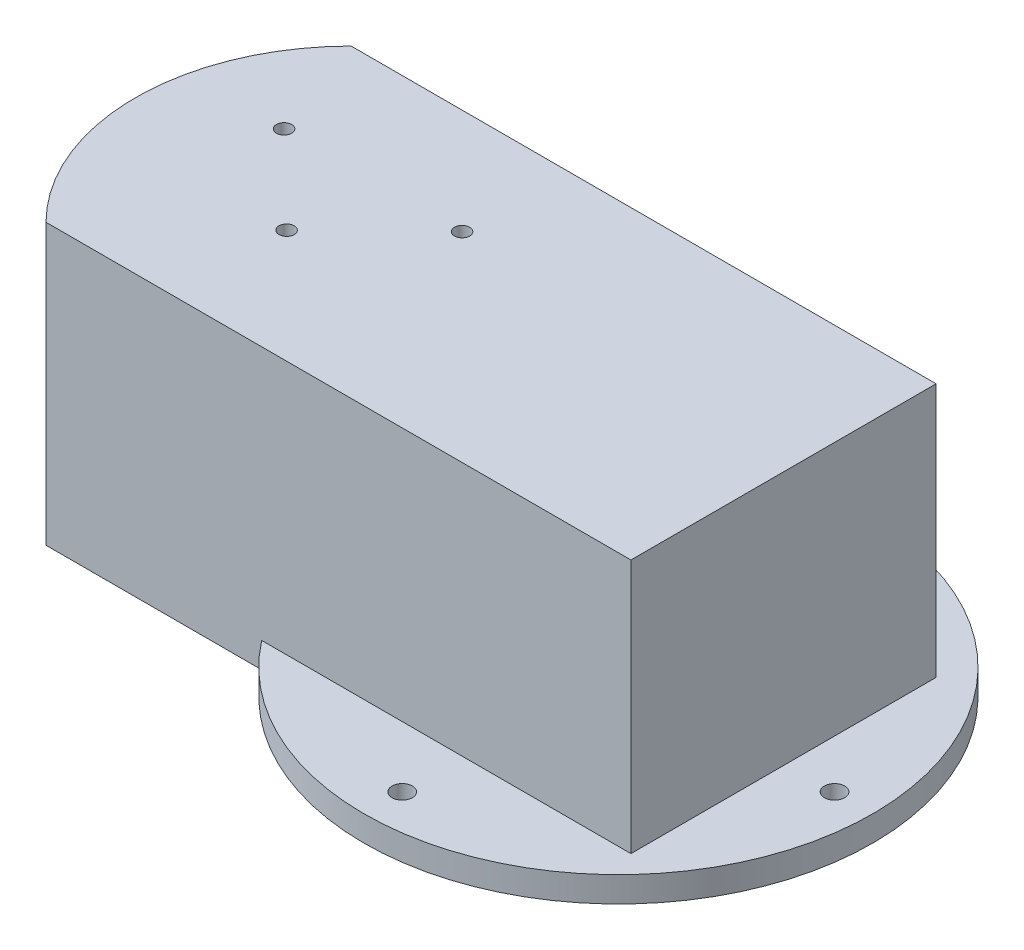
ISO-10303-21;
HEADER;
FILE_DESCRIPTION(('STEP AP214'),'2;1');
FILE_NAME('part.step','',(''),(''),'','','');
FILE_SCHEMA(('AUTOMOTIVE_DESIGN { 1 0 10303 214 1 1 1 1 }'));
ENDSEC;
DATA;
#1=APPLICATION_CONTEXT('core data for automotive mechanical design processes');
#2=APPLICATION_PROTOCOL_DEFINITION('international standard','automotive_design',2000,#1);
#3=PRODUCT_CONTEXT('',#1,'mechanical');
#4=PRODUCT('Part','Part','',(#3));
#5=PRODUCT_RELATED_PRODUCT_CATEGORY('part','',(#4));
#6=PRODUCT_DEFINITION_FORMATION('','',#4);
#7=PRODUCT_DEFINITION_CONTEXT('part definition',#1,'design');
#8=PRODUCT_DEFINITION('design','',#6,#7);
#9=PRODUCT_DEFINITION_SHAPE('','',#8);
#10=(LENGTH_UNIT() NAMED_UNIT(*) SI_UNIT(.MILLI.,.METRE.));
#11=(NAMED_UNIT(*) PLANE_ANGLE_UNIT() SI_UNIT($,.RADIAN.));
#12=(NAMED_UNIT(*) SI_UNIT($,.STERADIAN.) SOLID_ANGLE_UNIT());
#13=UNCERTAINTY_MEASURE_WITH_UNIT(LENGTH_MEASURE(1.E-05),#10,'distance_accuracy_value','');
#14=(GEOMETRIC_REPRESENTATION_CONTEXT(3) GLOBAL_UNCERTAINTY_ASSIGNED_CONTEXT((#13)) GLOBAL_UNIT_ASSIGNED_CONTEXT((#10,
#11,#12)) REPRESENTATION_CONTEXT('',''));
#15=CARTESIAN_POINT('',(0.,0.,0.));
#16=DIRECTION('',(0.,0.,1.));
#17=DIRECTION('',(1.,0.,0.));
#18=AXIS2_PLACEMENT_3D('',#15,#16,#17);
#19=CARTESIAN_POINT('',(0.,5.,0.));
#20=DIRECTION('',(0.,-1.,0.));
#21=DIRECTION('',(0.,0.,-1.));
#22=AXIS2_PLACEMENT_3D('',#19,#20,#21);
#23=CYLINDRICAL_SURFACE('',#22,50.);
#24=CARTESIAN_POINT('',(0.,5.,0.));
#25=DIRECTION('',(0.,1.,0.));
#26=DIRECTION('',(0.,0.,1.));
#27=AXIS2_PLACEMENT_3D('',#24,#25,#26);
#28=CIRCLE('',#27,50.);
#29=CARTESIAN_POINT('',(-39.5939845288782,5.,30.5338564404655));
#30=VERTEX_POINT('',#29);
#31=CARTESIAN_POINT('',(-40.3948806623922,5.,-29.4661435595345));
#32=VERTEX_POINT('',#31);
#33=EDGE_CURVE('E11',#30,#32,#28,.T.);
#34=ORIENTED_EDGE('',*,*,#33,.F.);
#35=DIRECTION('',(0.,-1.,0.));
#36=VECTOR('',#35,1.);
#37=CARTESIAN_POINT('',(-39.5939845288782,5.,30.5338564404655));
#38=LINE('',#37,#36);
#39=CARTESIAN_POINT('',(-39.5939845288782,0.,30.5338564404655));
#40=VERTEX_POINT('',#39);
#41=EDGE_CURVE('E157',#30,#40,#38,.T.);
#42=ORIENTED_EDGE('',*,*,#41,.T.);
#43=CARTESIAN_POINT('',(0.,0.,0.));
#44=DIRECTION('',(0.,1.,0.));
#45=DIRECTION('',(0.,0.,1.));
#46=AXIS2_PLACEMENT_3D('',#43,#44,#45);
#47=CIRCLE('',#46,50.);
#48=CARTESIAN_POINT('',(-40.3948806623922,0.,-29.4661435595345));
#49=VERTEX_POINT('',#48);
#50=EDGE_CURVE('E47',#40,#49,#47,.T.);
#51=ORIENTED_EDGE('',*,*,#50,.T.);
#52=DIRECTION('',(0.,-1.,0.));
#53=VECTOR('',#52,1.);
#54=CARTESIAN_POINT('',(-40.3948806623922,5.,-29.4661435595345));
#55=LINE('',#54,#53);
#56=EDGE_CURVE('E154',#32,#49,#55,.T.);
#57=ORIENTED_EDGE('',*,*,#56,.F.);
#58=EDGE_LOOP('',(#34,#42,#51,#57));
#59=FACE_BOUND('',#58,.T.);
#60=ADVANCED_FACE('F39',(#59),#23,.T.);
#61=CARTESIAN_POINT('',(0.,5.,0.));
#62=DIRECTION('',(0.,1.,0.));
#63=DIRECTION('',(0.,0.,1.));
#64=AXIS2_PLACEMENT_3D('',#61,#62,#63);
#65=PLANE('',#64);
#66=CARTESIAN_POINT('',(0.,5.,42.5));
#67=DIRECTION('',(0.,1.,0.));
#68=DIRECTION('',(0.,0.,1.));
#69=AXIS2_PLACEMENT_3D('',#66,#67,#68);
#70=CIRCLE('',#69,2.);
#71=CARTESIAN_POINT('',(0.,5.,44.5));
#72=VERTEX_POINT('',#71);
#73=EDGE_CURVE('E129',#72,#72,#70,.T.);
#74=ORIENTED_EDGE('',*,*,#73,.F.);
#75=EDGE_LOOP('',(#74));
#76=FACE_BOUND('',#75,.T.);
#77=CARTESIAN_POINT('',(0.,5.,-42.5));
#78=DIRECTION('',(0.,1.,0.));
#79=DIRECTION('',(0.,0.,1.));
#80=AXIS2_PLACEMENT_3D('',#77,#78,#79);
#81=CIRCLE('',#80,2.);
#82=CARTESIAN_POINT('',(0.,5.,-40.5));
#83=VERTEX_POINT('',#82);
#84=EDGE_CURVE('E136',#83,#83,#81,.T.);
#85=ORIENTED_EDGE('',*,*,#84,.F.);
#86=EDGE_LOOP('',(#85));
#87=FACE_BOUND('',#86,.T.);
#88=CARTESIAN_POINT('',(42.5,5.,0.));
#89=DIRECTION('',(0.,1.,0.));
#90=DIRECTION('',(0.,0.,1.));
#91=AXIS2_PLACEMENT_3D('',#88,#89,#90);
#92=CIRCLE('',#91,2.);
#93=CARTESIAN_POINT('',(42.5,5.,2.));
#94=VERTEX_POINT('',#93);
#95=EDGE_CURVE('E122',#94,#94,#92,.T.);
#96=ORIENTED_EDGE('',*,*,#95,.F.);
#97=EDGE_LOOP('',(#96));
#98=FACE_BOUND('',#97,.T.);
#99=DIRECTION('',(1.,0.,0.));
#100=VECTOR('',#99,1.);
#101=CARTESIAN_POINT('',(0.,5.,30.5338564404655));
#102=LINE('',#101,#100);
#103=CARTESIAN_POINT('',(33.,5.,30.5338564404655));
#104=VERTEX_POINT('',#103);
#105=EDGE_CURVE('E58',#30,#104,#102,.T.);
#106=ORIENTED_EDGE('',*,*,#105,.F.);
#107=ORIENTED_EDGE('',*,*,#33,.T.);
#108=DIRECTION('',(1.,0.,0.));
#109=VECTOR('',#108,1.);
#110=CARTESIAN_POINT('',(0.,5.,-29.4661435595345));
#111=LINE('',#110,#109);
#112=CARTESIAN_POINT('',(33.,5.,-29.4661435595345));
#113=VERTEX_POINT('',#112);
#114=EDGE_CURVE('E152',#32,#113,#111,.T.);
#115=ORIENTED_EDGE('',*,*,#114,.T.);
#116=DIRECTION('',(0.,0.,-1.));
#117=VECTOR('',#116,1.);
#118=CARTESIAN_POINT('',(33.,5.,0.));
#119=LINE('',#118,#117);
#120=EDGE_CURVE('E55',#104,#113,#119,.T.);
#121=ORIENTED_EDGE('',*,*,#120,.F.);
#122=EDGE_LOOP('',(#106,#107,#115,#121));
#123=FACE_BOUND('',#122,.T.);
#124=ADVANCED_FACE('F188',(#76,#87,#98,#123),#65,.T.);
#125=CARTESIAN_POINT('',(0.,0.,0.));
#126=DIRECTION('',(0.,1.,0.));
#127=DIRECTION('',(0.,0.,1.));
#128=AXIS2_PLACEMENT_3D('',#125,#126,#127);
#129=PLANE('',#128);
#130=CARTESIAN_POINT('',(-74.5,0.,-8.76897036105712));
#131=DIRECTION('',(0.,1.,0.));
#132=DIRECTION('',(0.,0.,1.));
#133=AXIS2_PLACEMENT_3D('',#130,#131,#132);
#134=CIRCLE('',#133,1.5);
#135=CARTESIAN_POINT('',(-74.5,0.,-7.26897036105713));
#136=VERTEX_POINT('',#135);
#137=EDGE_CURVE('E120',#136,#136,#134,.T.);
#138=ORIENTED_EDGE('',*,*,#137,.T.);
#139=EDGE_LOOP('',(#138));
#140=FACE_BOUND('',#139,.T.);
#141=CARTESIAN_POINT('',(-39.5,0.,-8.76897036105713));
#142=DIRECTION('',(0.,1.,0.));
#143=DIRECTION('',(0.,0.,1.));
#144=AXIS2_PLACEMENT_3D('',#141,#142,#143);
#145=CIRCLE('',#144,1.5);
#146=CARTESIAN_POINT('',(-39.5,0.,-7.26897036105712));
#147=VERTEX_POINT('',#146);
#148=EDGE_CURVE('E225',#147,#147,#145,.T.);
#149=ORIENTED_EDGE('',*,*,#148,.T.);
#150=EDGE_LOOP('',(#149));
#151=FACE_BOUND('',#150,.T.);
#152=CARTESIAN_POINT('',(-57.,0.,8.23102963894287));
#153=DIRECTION('',(0.,1.,0.));
#154=DIRECTION('',(0.,0.,1.));
#155=AXIS2_PLACEMENT_3D('',#152,#153,#154);
#156=CIRCLE('',#155,1.5);
#157=CARTESIAN_POINT('',(-57.,0.,9.73102963894287));
#158=VERTEX_POINT('',#157);
#159=EDGE_CURVE('E228',#158,#158,#156,.T.);
#160=ORIENTED_EDGE('',*,*,#159,.T.);
#161=EDGE_LOOP('',(#160));
#162=FACE_BOUND('',#161,.T.);
#163=CARTESIAN_POINT('',(0.,0.,42.5));
#164=DIRECTION('',(0.,1.,0.));
#165=DIRECTION('',(0.,0.,1.));
#166=AXIS2_PLACEMENT_3D('',#163,#164,#165);
#167=CIRCLE('',#166,2.);
#168=CARTESIAN_POINT('',(0.,0.,44.5));
#169=VERTEX_POINT('',#168);
#170=EDGE_CURVE('E42',#169,#169,#167,.T.);
#171=ORIENTED_EDGE('',*,*,#170,.T.);
#172=EDGE_LOOP('',(#171));
#173=FACE_BOUND('',#172,.T.);
#174=CARTESIAN_POINT('',(-42.5,0.,0.));
#175=DIRECTION('',(0.,1.,0.));
#176=DIRECTION('',(0.,0.,1.));
#177=AXIS2_PLACEMENT_3D('',#174,#175,#176);
#178=CIRCLE('',#177,2.);
#179=CARTESIAN_POINT('',(-42.5,0.,2.));
#180=VERTEX_POINT('',#179);
#181=EDGE_CURVE('E164',#180,#180,#178,.T.);
#182=ORIENTED_EDGE('',*,*,#181,.T.);
#183=EDGE_LOOP('',(#182));
#184=FACE_BOUND('',#183,.T.);
#185=CARTESIAN_POINT('',(0.,0.,-42.5));
#186=DIRECTION('',(0.,1.,0.));
#187=DIRECTION('',(0.,0.,1.));
#188=AXIS2_PLACEMENT_3D('',#185,#186,#187);
#189=CIRCLE('',#188,2.);
#190=CARTESIAN_POINT('',(0.,0.,-40.5));
#191=VERTEX_POINT('',#190);
#192=EDGE_CURVE('E162',#191,#191,#189,.T.);
#193=ORIENTED_EDGE('',*,*,#192,.T.);
#194=EDGE_LOOP('',(#193));
#195=FACE_BOUND('',#194,.T.);
#196=CARTESIAN_POINT('',(42.5,0.,0.));
#197=DIRECTION('',(0.,1.,0.));
#198=DIRECTION('',(0.,0.,1.));
#199=AXIS2_PLACEMENT_3D('',#196,#197,#198);
#200=CIRCLE('',#199,2.);
#201=CARTESIAN_POINT('',(42.5,0.,2.));
#202=VERTEX_POINT('',#201);
#203=EDGE_CURVE('E132',#202,#202,#200,.T.);
#204=ORIENTED_EDGE('',*,*,#203,.T.);
#205=EDGE_LOOP('',(#204));
#206=FACE_BOUND('',#205,.T.);
#207=ORIENTED_EDGE('',*,*,#50,.F.);
#208=DIRECTION('',(1.,0.,0.));
#209=VECTOR('',#208,1.);
#210=CARTESIAN_POINT('',(0.,0.,30.5338564404655));
#211=LINE('',#210,#209);
#212=CARTESIAN_POINT('',(-82.,0.,30.5338564404655));
#213=VERTEX_POINT('',#212);
#214=EDGE_CURVE('E102',#213,#40,#211,.T.);
#215=ORIENTED_EDGE('',*,*,#214,.F.);
#216=CARTESIAN_POINT('',(-51.9999999999999,0.,0.533856440465511));
#217=DIRECTION('',(0.,1.,0.));
#218=DIRECTION('',(0.,0.,-1.));
#219=AXIS2_PLACEMENT_3D('',#216,#217,#218);
#220=CIRCLE('',#219,42.4264068711929);
#221=CARTESIAN_POINT('',(-82.,0.,-29.4661435595345));
#222=VERTEX_POINT('',#221);
#223=EDGE_CURVE('E119',#222,#213,#220,.T.);
#224=ORIENTED_EDGE('',*,*,#223,.F.);
#225=DIRECTION('',(1.,0.,0.));
#226=VECTOR('',#225,1.);
#227=CARTESIAN_POINT('',(0.,0.,-29.4661435595345));
#228=LINE('',#227,#226);
#229=EDGE_CURVE('E110',#222,#49,#228,.T.);
#230=ORIENTED_EDGE('',*,*,#229,.T.);
#231=EDGE_LOOP('',(#207,#215,#224,#230));
#232=FACE_BOUND('',#231,.T.);
#233=ADVANCED_FACE('F171',(#140,#151,#162,#173,#184,#195,#206,#232),#129,.F.);
#234=CARTESIAN_POINT('',(0.,0.,30.5338564404655));
#235=DIRECTION('',(0.,0.,1.));
#236=DIRECTION('',(1.,0.,0.));
#237=AXIS2_PLACEMENT_3D('',#234,#235,#236);
#238=PLANE('',#237);
#239=ORIENTED_EDGE('',*,*,#41,.F.);
#240=ORIENTED_EDGE('',*,*,#105,.T.);
#241=DIRECTION('',(0.,1.,0.));
#242=VECTOR('',#241,1.);
#243=CARTESIAN_POINT('',(33.,0.,30.5338564404655));
#244=LINE('',#243,#242);
#245=CARTESIAN_POINT('',(33.,55.,30.5338564404655));
#246=VERTEX_POINT('',#245);
#247=EDGE_CURVE('E147',#104,#246,#244,.T.);
#248=ORIENTED_EDGE('',*,*,#247,.T.);
#249=DIRECTION('',(1.,0.,0.));
#250=VECTOR('',#249,1.);
#251=CARTESIAN_POINT('',(0.,55.,30.5338564404655));
#252=LINE('',#251,#250);
#253=CARTESIAN_POINT('',(-82.,55.,30.5338564404655));
#254=VERTEX_POINT('',#253);
#255=EDGE_CURVE('E141',#254,#246,#252,.T.);
#256=ORIENTED_EDGE('',*,*,#255,.F.);
#257=DIRECTION('',(0.,1.,0.));
#258=VECTOR('',#257,1.);
#259=CARTESIAN_POINT('',(-82.,0.,30.5338564404655));
#260=LINE('',#259,#258);
#261=EDGE_CURVE('E114',#213,#254,#260,.T.);
#262=ORIENTED_EDGE('',*,*,#261,.F.);
#263=ORIENTED_EDGE('',*,*,#214,.T.);
#264=EDGE_LOOP('',(#239,#240,#248,#256,#262,#263));
#265=FACE_BOUND('',#264,.T.);
#266=ADVANCED_FACE('F198',(#265),#238,.T.);
#267=CARTESIAN_POINT('',(0.,0.,-29.4661435595345));
#268=DIRECTION('',(0.,0.,1.));
#269=DIRECTION('',(1.,0.,0.));
#270=AXIS2_PLACEMENT_3D('',#267,#268,#269);
#271=PLANE('',#270);
#272=ORIENTED_EDGE('',*,*,#114,.F.);
#273=ORIENTED_EDGE('',*,*,#56,.T.);
#274=ORIENTED_EDGE('',*,*,#229,.F.);
#275=DIRECTION('',(0.,1.,0.));
#276=VECTOR('',#275,1.);
#277=CARTESIAN_POINT('',(-82.,0.,-29.4661435595345));
#278=LINE('',#277,#276);
#279=CARTESIAN_POINT('',(-82.,55.,-29.4661435595345));
#280=VERTEX_POINT('',#279);
#281=EDGE_CURVE('E105',#222,#280,#278,.T.);
#282=ORIENTED_EDGE('',*,*,#281,.T.);
#283=DIRECTION('',(1.,0.,0.));
#284=VECTOR('',#283,1.);
#285=CARTESIAN_POINT('',(0.,55.,-29.4661435595345));
#286=LINE('',#285,#284);
#287=CARTESIAN_POINT('',(33.,55.,-29.4661435595345));
#288=VERTEX_POINT('',#287);
#289=EDGE_CURVE('E92',#280,#288,#286,.T.);
#290=ORIENTED_EDGE('',*,*,#289,.T.);
#291=DIRECTION('',(0.,1.,0.));
#292=VECTOR('',#291,1.);
#293=CARTESIAN_POINT('',(33.,0.,-29.4661435595345));
#294=LINE('',#293,#292);
#295=EDGE_CURVE('E115',#113,#288,#294,.T.);
#296=ORIENTED_EDGE('',*,*,#295,.F.);
#297=EDGE_LOOP('',(#272,#273,#274,#282,#290,#296));
#298=FACE_BOUND('',#297,.T.);
#299=ADVANCED_FACE('F107',(#298),#271,.F.);
#300=CARTESIAN_POINT('',(33.,0.,0.));
#301=DIRECTION('',(1.,0.,0.));
#302=DIRECTION('',(0.,0.,-1.));
#303=AXIS2_PLACEMENT_3D('',#300,#301,#302);
#304=PLANE('',#303);
#305=ORIENTED_EDGE('',*,*,#247,.F.);
#306=ORIENTED_EDGE('',*,*,#120,.T.);
#307=ORIENTED_EDGE('',*,*,#295,.T.);
#308=DIRECTION('',(0.,0.,-1.));
#309=VECTOR('',#308,1.);
#310=CARTESIAN_POINT('',(33.,55.,0.));
#311=LINE('',#310,#309);
#312=EDGE_CURVE('E99',#246,#288,#311,.T.);
#313=ORIENTED_EDGE('',*,*,#312,.F.);
#314=EDGE_LOOP('',(#305,#306,#307,#313));
#315=FACE_BOUND('',#314,.T.);
#316=ADVANCED_FACE('F203',(#315),#304,.T.);
#317=CARTESIAN_POINT('',(0.,55.,0.));
#318=DIRECTION('',(0.,1.,0.));
#319=DIRECTION('',(0.,0.,1.));
#320=AXIS2_PLACEMENT_3D('',#317,#318,#319);
#321=PLANE('',#320);
#322=CARTESIAN_POINT('',(-74.5,55.,-8.76897036105712));
#323=DIRECTION('',(0.,1.,0.));
#324=DIRECTION('',(0.,0.,1.));
#325=AXIS2_PLACEMENT_3D('',#322,#323,#324);
#326=CIRCLE('',#325,1.5);
#327=CARTESIAN_POINT('',(-74.5,55.,-7.26897036105713));
#328=VERTEX_POINT('',#327);
#329=EDGE_CURVE('E125',#328,#328,#326,.T.);
#330=ORIENTED_EDGE('',*,*,#329,.F.);
#331=EDGE_LOOP('',(#330));
#332=FACE_BOUND('',#331,.T.);
#333=CARTESIAN_POINT('',(-39.5,55.,-8.76897036105713));
#334=DIRECTION('',(0.,1.,0.));
#335=DIRECTION('',(0.,0.,1.));
#336=AXIS2_PLACEMENT_3D('',#333,#334,#335);
#337=CIRCLE('',#336,1.5);
#338=CARTESIAN_POINT('',(-39.5,55.,-7.26897036105712));
#339=VERTEX_POINT('',#338);
#340=EDGE_CURVE('E230',#339,#339,#337,.T.);
#341=ORIENTED_EDGE('',*,*,#340,.F.);
#342=EDGE_LOOP('',(#341));
#343=FACE_BOUND('',#342,.T.);
#344=CARTESIAN_POINT('',(-57.,55.,8.23102963894287));
#345=DIRECTION('',(0.,1.,0.));
#346=DIRECTION('',(0.,0.,1.));
#347=AXIS2_PLACEMENT_3D('',#344,#345,#346);
#348=CIRCLE('',#347,1.5);
#349=CARTESIAN_POINT('',(-57.,55.,9.73102963894287));
#350=VERTEX_POINT('',#349);
#351=EDGE_CURVE('E231',#350,#350,#348,.T.);
#352=ORIENTED_EDGE('',*,*,#351,.F.);
#353=EDGE_LOOP('',(#352));
#354=FACE_BOUND('',#353,.T.);
#355=ORIENTED_EDGE('',*,*,#255,.T.);
#356=ORIENTED_EDGE('',*,*,#312,.T.);
#357=ORIENTED_EDGE('',*,*,#289,.F.);
#358=CARTESIAN_POINT('',(-51.9999999999999,55.,0.533856440465511));
#359=DIRECTION('',(0.,1.,0.));
#360=DIRECTION('',(0.,0.,-1.));
#361=AXIS2_PLACEMENT_3D('',#358,#359,#360);
#362=CIRCLE('',#361,42.4264068711929);
#363=EDGE_CURVE('E97',#280,#254,#362,.T.);
#364=ORIENTED_EDGE('',*,*,#363,.T.);
#365=EDGE_LOOP('',(#355,#356,#357,#364));
#366=FACE_BOUND('',#365,.T.);
#367=ADVANCED_FACE('F95',(#332,#343,#354,#366),#321,.T.);
#368=CARTESIAN_POINT('',(42.5,-45.,0.));
#369=DIRECTION('',(0.,1.,0.));
#370=DIRECTION('',(0.,0.,1.));
#371=AXIS2_PLACEMENT_3D('',#368,#369,#370);
#372=CYLINDRICAL_SURFACE('',#371,2.);
#373=ORIENTED_EDGE('',*,*,#95,.T.);
#374=EDGE_LOOP('',(#373));
#375=FACE_BOUND('',#374,.T.);
#376=ORIENTED_EDGE('',*,*,#203,.F.);
#377=EDGE_LOOP('',(#376));
#378=FACE_BOUND('',#377,.T.);
#379=ADVANCED_FACE('F210',(#375,#378),#372,.F.);
#380=CARTESIAN_POINT('',(0.,-45.,-42.5));
#381=DIRECTION('',(0.,1.,0.));
#382=DIRECTION('',(0.,0.,1.));
#383=AXIS2_PLACEMENT_3D('',#380,#381,#382);
#384=CYLINDRICAL_SURFACE('',#383,2.);
#385=ORIENTED_EDGE('',*,*,#84,.T.);
#386=EDGE_LOOP('',(#385));
#387=FACE_BOUND('',#386,.T.);
#388=ORIENTED_EDGE('',*,*,#192,.F.);
#389=EDGE_LOOP('',(#388));
#390=FACE_BOUND('',#389,.T.);
#391=ADVANCED_FACE('F319',(#387,#390),#384,.F.);
#392=CARTESIAN_POINT('',(-42.5,-45.,0.));
#393=DIRECTION('',(0.,1.,0.));
#394=DIRECTION('',(0.,0.,1.));
#395=AXIS2_PLACEMENT_3D('',#392,#393,#394);
#396=CYLINDRICAL_SURFACE('',#395,2.);
#397=CARTESIAN_POINT('',(-42.5,5.,0.));
#398=DIRECTION('',(0.,1.,0.));
#399=DIRECTION('',(0.,0.,1.));
#400=AXIS2_PLACEMENT_3D('',#397,#398,#399);
#401=CIRCLE('',#400,2.);
#402=CARTESIAN_POINT('',(-42.5,5.,2.));
#403=VERTEX_POINT('',#402);
#404=EDGE_CURVE('E133',#403,#403,#401,.T.);
#405=ORIENTED_EDGE('',*,*,#404,.T.);
#406=EDGE_LOOP('',(#405));
#407=FACE_BOUND('',#406,.T.);
#408=ORIENTED_EDGE('',*,*,#181,.F.);
#409=EDGE_LOOP('',(#408));
#410=FACE_BOUND('',#409,.T.);
#411=ADVANCED_FACE('F184',(#407,#410),#396,.F.);
#412=CARTESIAN_POINT('',(-42.5,5.,0.));
#413=DIRECTION('',(0.,1.,0.));
#414=DIRECTION('',(0.,0.,1.));
#415=AXIS2_PLACEMENT_3D('',#412,#413,#414);
#416=PLANE('',#415);
#417=ORIENTED_EDGE('',*,*,#404,.F.);
#418=EDGE_LOOP('',(#417));
#419=FACE_BOUND('',#418,.T.);
#420=ADVANCED_FACE('F175',(#419),#416,.F.);
#421=CARTESIAN_POINT('',(0.,-45.,42.5));
#422=DIRECTION('',(0.,1.,0.));
#423=DIRECTION('',(0.,0.,1.));
#424=AXIS2_PLACEMENT_3D('',#421,#422,#423);
#425=CYLINDRICAL_SURFACE('',#424,2.);
#426=ORIENTED_EDGE('',*,*,#73,.T.);
#427=EDGE_LOOP('',(#426));
#428=FACE_BOUND('',#427,.T.);
#429=ORIENTED_EDGE('',*,*,#170,.F.);
#430=EDGE_LOOP('',(#429));
#431=FACE_BOUND('',#430,.T.);
#432=ADVANCED_FACE('F173',(#428,#431),#425,.F.);
#433=CARTESIAN_POINT('',(-51.9999999999999,0.,0.533856440465511));
#434=DIRECTION('',(0.,1.,0.));
#435=DIRECTION('',(0.,0.,1.));
#436=AXIS2_PLACEMENT_3D('',#433,#434,#435);
#437=CYLINDRICAL_SURFACE('',#436,42.4264068711929);
#438=ORIENTED_EDGE('',*,*,#363,.F.);
#439=ORIENTED_EDGE('',*,*,#281,.F.);
#440=ORIENTED_EDGE('',*,*,#223,.T.);
#441=ORIENTED_EDGE('',*,*,#261,.T.);
#442=EDGE_LOOP('',(#438,#439,#440,#441));
#443=FACE_BOUND('',#442,.T.);
#444=ADVANCED_FACE('F118',(#443),#437,.T.);
#445=CARTESIAN_POINT('',(-57.,0.,8.23102963894287));
#446=DIRECTION('',(0.,1.,0.));
#447=DIRECTION('',(0.,0.,1.));
#448=AXIS2_PLACEMENT_3D('',#445,#446,#447);
#449=CYLINDRICAL_SURFACE('',#448,1.5);
#450=ORIENTED_EDGE('',*,*,#159,.F.);
#451=EDGE_LOOP('',(#450));
#452=FACE_BOUND('',#451,.T.);
#453=ORIENTED_EDGE('',*,*,#351,.T.);
#454=EDGE_LOOP('',(#453));
#455=FACE_BOUND('',#454,.T.);
#456=ADVANCED_FACE('F182',(#452,#455),#449,.F.);
#457=CARTESIAN_POINT('',(-39.5,0.,-8.76897036105713));
#458=DIRECTION('',(0.,1.,0.));
#459=DIRECTION('',(0.,0.,1.));
#460=AXIS2_PLACEMENT_3D('',#457,#458,#459);
#461=CYLINDRICAL_SURFACE('',#460,1.5);
#462=ORIENTED_EDGE('',*,*,#148,.F.);
#463=EDGE_LOOP('',(#462));
#464=FACE_BOUND('',#463,.T.);
#465=ORIENTED_EDGE('',*,*,#340,.T.);
#466=EDGE_LOOP('',(#465));
#467=FACE_BOUND('',#466,.T.);
#468=ADVANCED_FACE('F248',(#464,#467),#461,.F.);
#469=CARTESIAN_POINT('',(-74.5,0.,-8.76897036105712));
#470=DIRECTION('',(0.,1.,0.));
#471=DIRECTION('',(0.,0.,1.));
#472=AXIS2_PLACEMENT_3D('',#469,#470,#471);
#473=CYLINDRICAL_SURFACE('',#472,1.5);
#474=ORIENTED_EDGE('',*,*,#137,.F.);
#475=EDGE_LOOP('',(#474));
#476=FACE_BOUND('',#475,.T.);
#477=ORIENTED_EDGE('',*,*,#329,.T.);
#478=EDGE_LOOP('',(#477));
#479=FACE_BOUND('',#478,.T.);
#480=ADVANCED_FACE('F241',(#476,#479),#473,.F.);
#481=CLOSED_SHELL('',(#60,#124,#233,#266,#299,#316,#367,#379,#391,#411,#420,#432,#444,#456,#468,#480));
#482=MANIFOLD_SOLID_BREP('B2',#481);
#483=ADVANCED_BREP_SHAPE_REPRESENTATION('',(#18,#482),#14);
#484=SHAPE_DEFINITION_REPRESENTATION(#9,#483);
ENDSEC;
END-ISO-10303-21;
